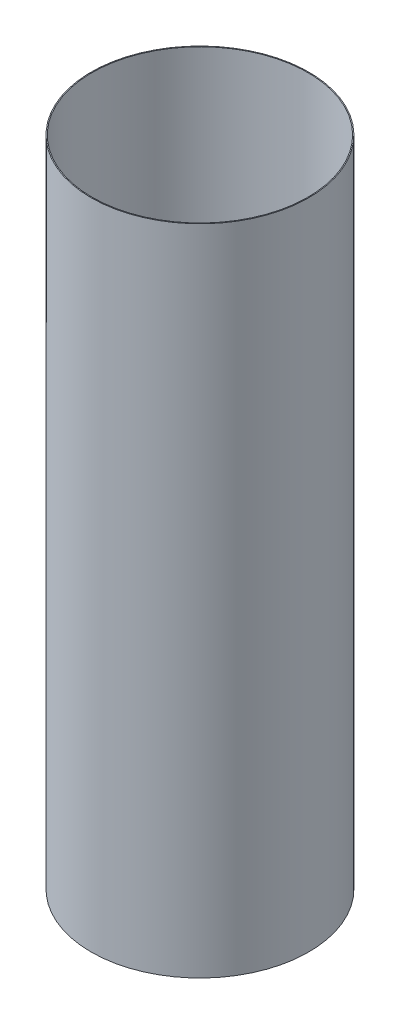
ISO-10303-21;
HEADER;
FILE_DESCRIPTION(('STEP AP214'),'2;1');
FILE_NAME('part.step','',(''),(''),'','','');
FILE_SCHEMA(('AUTOMOTIVE_DESIGN { 1 0 10303 214 1 1 1 1 }'));
ENDSEC;
DATA;
#1=APPLICATION_CONTEXT('core data for automotive mechanical design processes');
#2=APPLICATION_PROTOCOL_DEFINITION('international standard','automotive_design',2000,#1);
#3=PRODUCT_CONTEXT('',#1,'mechanical');
#4=PRODUCT('Part','Part','',(#3));
#5=PRODUCT_RELATED_PRODUCT_CATEGORY('part','',(#4));
#6=PRODUCT_DEFINITION_FORMATION('','',#4);
#7=PRODUCT_DEFINITION_CONTEXT('part definition',#1,'design');
#8=PRODUCT_DEFINITION('design','',#6,#7);
#9=PRODUCT_DEFINITION_SHAPE('','',#8);
#10=(LENGTH_UNIT() NAMED_UNIT(*) SI_UNIT(.MILLI.,.METRE.));
#11=(NAMED_UNIT(*) PLANE_ANGLE_UNIT() SI_UNIT($,.RADIAN.));
#12=(NAMED_UNIT(*) SI_UNIT($,.STERADIAN.) SOLID_ANGLE_UNIT());
#13=UNCERTAINTY_MEASURE_WITH_UNIT(LENGTH_MEASURE(1.E-05),#10,'distance_accuracy_value','');
#14=(GEOMETRIC_REPRESENTATION_CONTEXT(3) GLOBAL_UNCERTAINTY_ASSIGNED_CONTEXT((#13)) GLOBAL_UNIT_ASSIGNED_CONTEXT((#10,
#11,#12)) REPRESENTATION_CONTEXT('',''));
#15=CARTESIAN_POINT('',(0.,0.,0.));
#16=DIRECTION('',(0.,0.,1.));
#17=DIRECTION('',(1.,0.,0.));
#18=AXIS2_PLACEMENT_3D('',#15,#16,#17);
#19=CARTESIAN_POINT('',(0.,457.2,0.));
#20=DIRECTION('',(0.,1.,0.));
#21=DIRECTION('',(0.,0.,1.));
#22=AXIS2_PLACEMENT_3D('',#19,#20,#21);
#23=PLANE('',#22);
#24=CARTESIAN_POINT('',(0.,457.2,0.));
#25=DIRECTION('',(0.,1.,0.));
#26=DIRECTION('',(0.,0.,1.));
#27=AXIS2_PLACEMENT_3D('',#24,#25,#26);
#28=CIRCLE('',#27,76.2);
#29=CARTESIAN_POINT('',(0.,457.2,76.2));
#30=VERTEX_POINT('',#29);
#31=EDGE_CURVE('E10',#30,#30,#28,.T.);
#32=ORIENTED_EDGE('',*,*,#31,.T.);
#33=EDGE_LOOP('',(#32));
#34=FACE_BOUND('',#33,.T.);
#35=CARTESIAN_POINT('',(0.,457.2,0.));
#36=DIRECTION('',(0.,1.,0.));
#37=DIRECTION('',(0.,0.,1.));
#38=AXIS2_PLACEMENT_3D('',#35,#36,#37);
#39=CIRCLE('',#38,75.565);
#40=CARTESIAN_POINT('',(0.,457.2,75.565));
#41=VERTEX_POINT('',#40);
#42=EDGE_CURVE('E50',#41,#41,#39,.T.);
#43=ORIENTED_EDGE('',*,*,#42,.F.);
#44=EDGE_LOOP('',(#43));
#45=FACE_BOUND('',#44,.T.);
#46=ADVANCED_FACE('F37',(#34,#45),#23,.T.);
#47=CARTESIAN_POINT('',(0.,0.,0.));
#48=DIRECTION('',(0.,1.,0.));
#49=DIRECTION('',(0.,0.,1.));
#50=AXIS2_PLACEMENT_3D('',#47,#48,#49);
#51=PLANE('',#50);
#52=CARTESIAN_POINT('',(0.,0.,0.));
#53=DIRECTION('',(0.,1.,0.));
#54=DIRECTION('',(0.,0.,1.));
#55=AXIS2_PLACEMENT_3D('',#52,#53,#54);
#56=CIRCLE('',#55,76.2);
#57=CARTESIAN_POINT('',(0.,0.,76.2));
#58=VERTEX_POINT('',#57);
#59=EDGE_CURVE('E41',#58,#58,#56,.T.);
#60=ORIENTED_EDGE('',*,*,#59,.F.);
#61=EDGE_LOOP('',(#60));
#62=FACE_BOUND('',#61,.T.);
#63=CARTESIAN_POINT('',(0.,0.,0.));
#64=DIRECTION('',(0.,1.,0.));
#65=DIRECTION('',(0.,0.,1.));
#66=AXIS2_PLACEMENT_3D('',#63,#64,#65);
#67=CIRCLE('',#66,75.565);
#68=CARTESIAN_POINT('',(0.,0.,75.565));
#69=VERTEX_POINT('',#68);
#70=EDGE_CURVE('E52',#69,#69,#67,.T.);
#71=ORIENTED_EDGE('',*,*,#70,.T.);
#72=EDGE_LOOP('',(#71));
#73=FACE_BOUND('',#72,.T.);
#74=ADVANCED_FACE('F64',(#62,#73),#51,.F.);
#75=CARTESIAN_POINT('',(0.,457.2,0.));
#76=DIRECTION('',(0.,-1.,0.));
#77=DIRECTION('',(0.,0.,-1.));
#78=AXIS2_PLACEMENT_3D('',#75,#76,#77);
#79=CYLINDRICAL_SURFACE('',#78,76.2);
#80=ORIENTED_EDGE('',*,*,#31,.F.);
#81=EDGE_LOOP('',(#80));
#82=FACE_BOUND('',#81,.T.);
#83=ORIENTED_EDGE('',*,*,#59,.T.);
#84=EDGE_LOOP('',(#83));
#85=FACE_BOUND('',#84,.T.);
#86=ADVANCED_FACE('F39',(#82,#85),#79,.T.);
#87=CARTESIAN_POINT('',(0.,457.2,0.));
#88=DIRECTION('',(0.,-1.,0.));
#89=DIRECTION('',(0.,0.,-1.));
#90=AXIS2_PLACEMENT_3D('',#87,#88,#89);
#91=CYLINDRICAL_SURFACE('',#90,75.565);
#92=ORIENTED_EDGE('',*,*,#42,.T.);
#93=EDGE_LOOP('',(#92));
#94=FACE_BOUND('',#93,.T.);
#95=ORIENTED_EDGE('',*,*,#70,.F.);
#96=EDGE_LOOP('',(#95));
#97=FACE_BOUND('',#96,.T.);
#98=ADVANCED_FACE('F60',(#94,#97),#91,.F.);
#99=CLOSED_SHELL('',(#46,#74,#86,#98));
#100=MANIFOLD_SOLID_BREP('B2',#99);
#101=ADVANCED_BREP_SHAPE_REPRESENTATION('',(#18,#100),#14);
#102=SHAPE_DEFINITION_REPRESENTATION(#9,#101);
ENDSEC;
END-ISO-10303-21;
